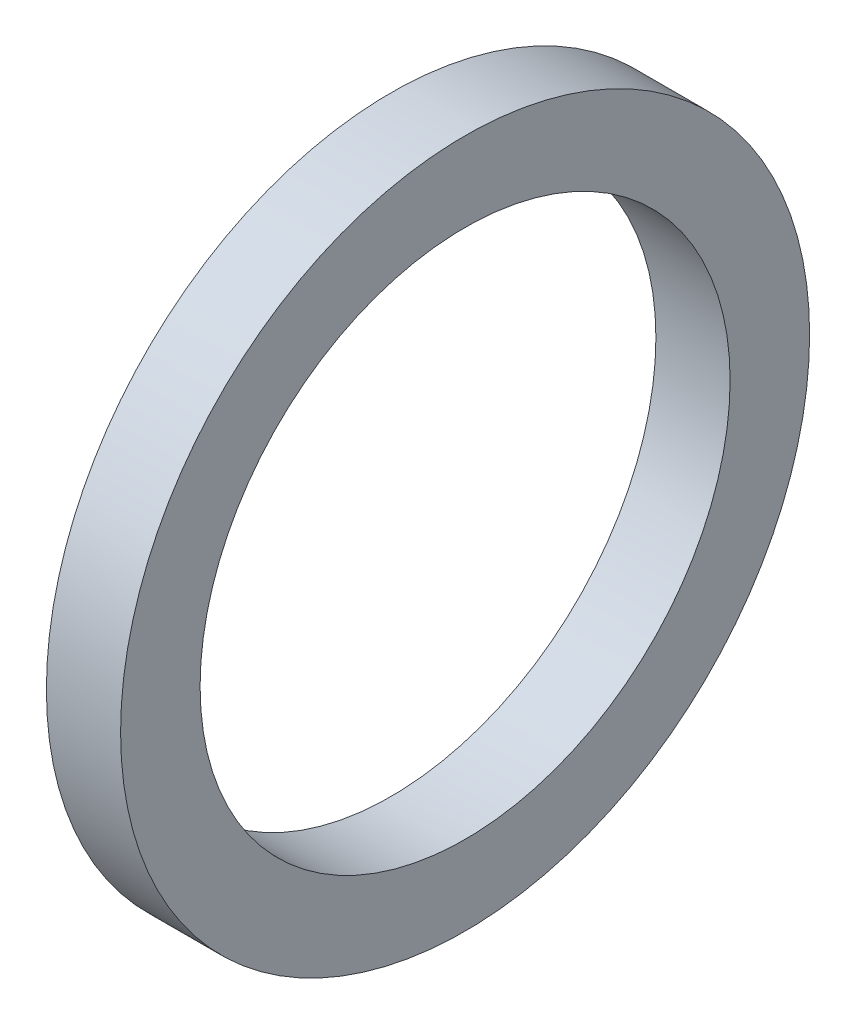
ISO-10303-21;
HEADER;
FILE_DESCRIPTION(('STEP AP214'),'2;1');
FILE_NAME('part.step','',(''),(''),'','','');
FILE_SCHEMA(('AUTOMOTIVE_DESIGN { 1 0 10303 214 1 1 1 1 }'));
ENDSEC;
DATA;
#1=APPLICATION_CONTEXT('core data for automotive mechanical design processes');
#2=APPLICATION_PROTOCOL_DEFINITION('international standard','automotive_design',2000,#1);
#3=PRODUCT_CONTEXT('',#1,'mechanical');
#4=PRODUCT('Part','Part','',(#3));
#5=PRODUCT_RELATED_PRODUCT_CATEGORY('part','',(#4));
#6=PRODUCT_DEFINITION_FORMATION('','',#4);
#7=PRODUCT_DEFINITION_CONTEXT('part definition',#1,'design');
#8=PRODUCT_DEFINITION('design','',#6,#7);
#9=PRODUCT_DEFINITION_SHAPE('','',#8);
#10=(LENGTH_UNIT() NAMED_UNIT(*) SI_UNIT(.MILLI.,.METRE.));
#11=(NAMED_UNIT(*) PLANE_ANGLE_UNIT() SI_UNIT($,.RADIAN.));
#12=(NAMED_UNIT(*) SI_UNIT($,.STERADIAN.) SOLID_ANGLE_UNIT());
#13=UNCERTAINTY_MEASURE_WITH_UNIT(LENGTH_MEASURE(1.E-05),#10,'distance_accuracy_value','');
#14=(GEOMETRIC_REPRESENTATION_CONTEXT(3) GLOBAL_UNCERTAINTY_ASSIGNED_CONTEXT((#13)) GLOBAL_UNIT_ASSIGNED_CONTEXT((#10,
#11,#12)) REPRESENTATION_CONTEXT('',''));
#15=CARTESIAN_POINT('',(0.,0.,0.));
#16=DIRECTION('',(0.,0.,1.));
#17=DIRECTION('',(1.,0.,0.));
#18=AXIS2_PLACEMENT_3D('',#15,#16,#17);
#19=CARTESIAN_POINT('',(7.,0.,0.));
#20=DIRECTION('',(1.,0.,0.));
#21=DIRECTION('',(0.,0.,-1.));
#22=AXIS2_PLACEMENT_3D('',#19,#20,#21);
#23=PLANE('',#22);
#24=CARTESIAN_POINT('',(7.,0.,0.));
#25=DIRECTION('',(1.,0.,0.));
#26=DIRECTION('',(0.,0.,-1.));
#27=AXIS2_PLACEMENT_3D('',#24,#25,#26);
#28=CIRCLE('',#27,32.5);
#29=CARTESIAN_POINT('',(7.,0.,-32.5));
#30=VERTEX_POINT('',#29);
#31=EDGE_CURVE('E10',#30,#30,#28,.T.);
#32=ORIENTED_EDGE('',*,*,#31,.T.);
#33=EDGE_LOOP('',(#32));
#34=FACE_BOUND('',#33,.T.);
#35=CARTESIAN_POINT('',(7.,0.,0.));
#36=DIRECTION('',(1.,0.,0.));
#37=DIRECTION('',(0.,0.,-1.));
#38=AXIS2_PLACEMENT_3D('',#35,#36,#37);
#39=CIRCLE('',#38,25.);
#40=CARTESIAN_POINT('',(7.,0.,-25.));
#41=VERTEX_POINT('',#40);
#42=EDGE_CURVE('E44',#41,#41,#39,.T.);
#43=ORIENTED_EDGE('',*,*,#42,.F.);
#44=EDGE_LOOP('',(#43));
#45=FACE_BOUND('',#44,.T.);
#46=ADVANCED_FACE('F33',(#34,#45),#23,.T.);
#47=CARTESIAN_POINT('',(0.,0.,0.));
#48=DIRECTION('',(1.,0.,0.));
#49=DIRECTION('',(0.,0.,-1.));
#50=AXIS2_PLACEMENT_3D('',#47,#48,#49);
#51=PLANE('',#50);
#52=CARTESIAN_POINT('',(0.,0.,0.));
#53=DIRECTION('',(1.,0.,0.));
#54=DIRECTION('',(0.,0.,-1.));
#55=AXIS2_PLACEMENT_3D('',#52,#53,#54);
#56=CIRCLE('',#55,32.5);
#57=CARTESIAN_POINT('',(0.,0.,-32.5));
#58=VERTEX_POINT('',#57);
#59=EDGE_CURVE('E37',#58,#58,#56,.T.);
#60=ORIENTED_EDGE('',*,*,#59,.F.);
#61=EDGE_LOOP('',(#60));
#62=FACE_BOUND('',#61,.T.);
#63=CARTESIAN_POINT('',(0.,0.,0.));
#64=DIRECTION('',(1.,0.,0.));
#65=DIRECTION('',(0.,0.,-1.));
#66=AXIS2_PLACEMENT_3D('',#63,#64,#65);
#67=CIRCLE('',#66,25.);
#68=CARTESIAN_POINT('',(0.,0.,-25.));
#69=VERTEX_POINT('',#68);
#70=EDGE_CURVE('E46',#69,#69,#67,.T.);
#71=ORIENTED_EDGE('',*,*,#70,.T.);
#72=EDGE_LOOP('',(#71));
#73=FACE_BOUND('',#72,.T.);
#74=ADVANCED_FACE('F56',(#62,#73),#51,.F.);
#75=CARTESIAN_POINT('',(7.,0.,0.));
#76=DIRECTION('',(-1.,0.,0.));
#77=DIRECTION('',(0.,0.,1.));
#78=AXIS2_PLACEMENT_3D('',#75,#76,#77);
#79=CYLINDRICAL_SURFACE('',#78,32.5);
#80=ORIENTED_EDGE('',*,*,#31,.F.);
#81=EDGE_LOOP('',(#80));
#82=FACE_BOUND('',#81,.T.);
#83=ORIENTED_EDGE('',*,*,#59,.T.);
#84=EDGE_LOOP('',(#83));
#85=FACE_BOUND('',#84,.T.);
#86=ADVANCED_FACE('F35',(#82,#85),#79,.T.);
#87=CARTESIAN_POINT('',(7.,0.,0.));
#88=DIRECTION('',(-1.,0.,0.));
#89=DIRECTION('',(0.,0.,1.));
#90=AXIS2_PLACEMENT_3D('',#87,#88,#89);
#91=CYLINDRICAL_SURFACE('',#90,25.);
#92=ORIENTED_EDGE('',*,*,#42,.T.);
#93=EDGE_LOOP('',(#92));
#94=FACE_BOUND('',#93,.T.);
#95=ORIENTED_EDGE('',*,*,#70,.F.);
#96=EDGE_LOOP('',(#95));
#97=FACE_BOUND('',#96,.T.);
#98=ADVANCED_FACE('F52',(#94,#97),#91,.F.);
#99=CLOSED_SHELL('',(#46,#74,#86,#98));
#100=MANIFOLD_SOLID_BREP('B2',#99);
#101=ADVANCED_BREP_SHAPE_REPRESENTATION('',(#18,#100),#14);
#102=SHAPE_DEFINITION_REPRESENTATION(#9,#101);
ENDSEC;
END-ISO-10303-21;
